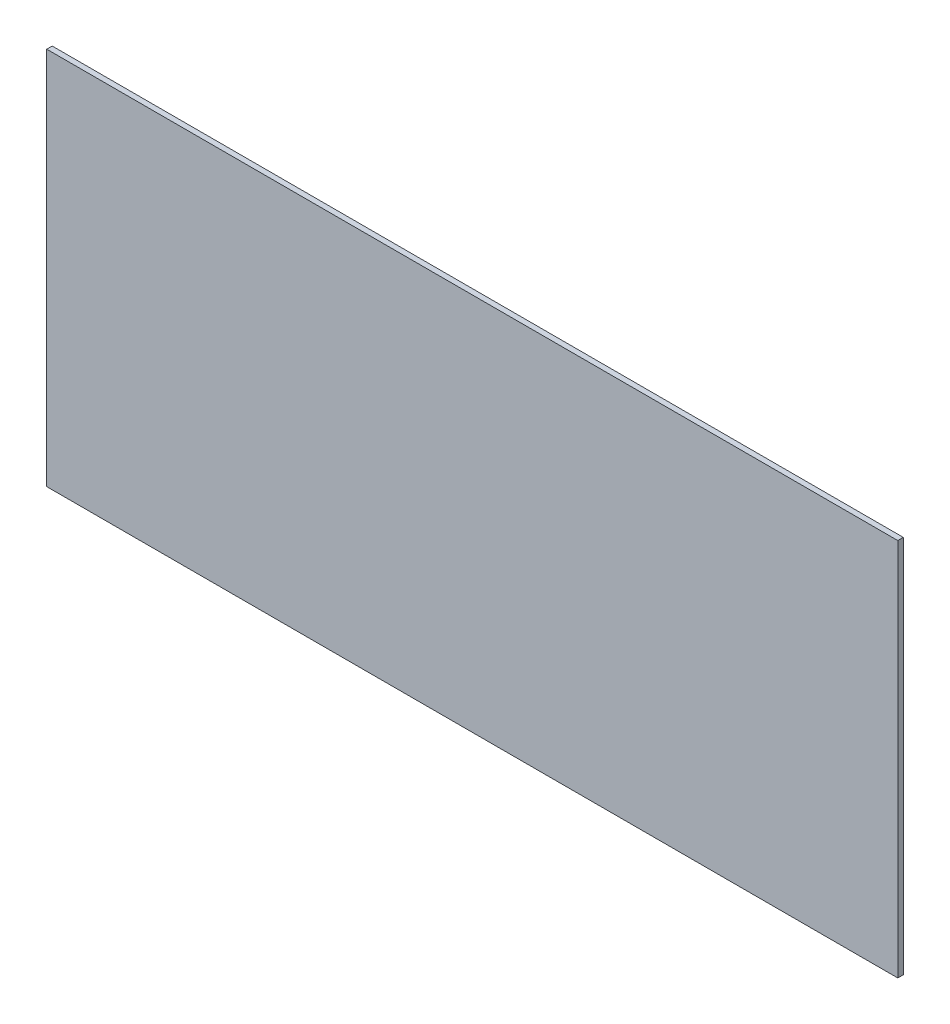
ISO-10303-21;
HEADER;
FILE_DESCRIPTION(('STEP AP214'),'2;1');
FILE_NAME('part.step','',(''),(''),'','','');
FILE_SCHEMA(('AUTOMOTIVE_DESIGN { 1 0 10303 214 1 1 1 1 }'));
ENDSEC;
DATA;
#1=APPLICATION_CONTEXT('core data for automotive mechanical design processes');
#2=APPLICATION_PROTOCOL_DEFINITION('international standard','automotive_design',2000,#1);
#3=PRODUCT_CONTEXT('',#1,'mechanical');
#4=PRODUCT('Part','Part','',(#3));
#5=PRODUCT_RELATED_PRODUCT_CATEGORY('part','',(#4));
#6=PRODUCT_DEFINITION_FORMATION('','',#4);
#7=PRODUCT_DEFINITION_CONTEXT('part definition',#1,'design');
#8=PRODUCT_DEFINITION('design','',#6,#7);
#9=PRODUCT_DEFINITION_SHAPE('','',#8);
#10=(LENGTH_UNIT() NAMED_UNIT(*) SI_UNIT(.MILLI.,.METRE.));
#11=(NAMED_UNIT(*) PLANE_ANGLE_UNIT() SI_UNIT($,.RADIAN.));
#12=(NAMED_UNIT(*) SI_UNIT($,.STERADIAN.) SOLID_ANGLE_UNIT());
#13=UNCERTAINTY_MEASURE_WITH_UNIT(LENGTH_MEASURE(1.E-05),#10,'distance_accuracy_value','');
#14=(GEOMETRIC_REPRESENTATION_CONTEXT(3) GLOBAL_UNCERTAINTY_ASSIGNED_CONTEXT((#13)) GLOBAL_UNIT_ASSIGNED_CONTEXT((#10,
#11,#12)) REPRESENTATION_CONTEXT('',''));
#15=CARTESIAN_POINT('',(0.,0.,0.));
#16=DIRECTION('',(0.,0.,1.));
#17=DIRECTION('',(1.,0.,0.));
#18=AXIS2_PLACEMENT_3D('',#15,#16,#17);
#19=CARTESIAN_POINT('',(0.,0.,6.35));
#20=DIRECTION('',(1.,0.,0.));
#21=DIRECTION('',(0.,1.,0.));
#22=AXIS2_PLACEMENT_3D('',#19,#20,#21);
#23=PLANE('',#22);
#24=DIRECTION('',(0.,-1.,0.));
#25=VECTOR('',#24,1.);
#26=CARTESIAN_POINT('',(0.,0.,0.));
#27=LINE('',#26,#25);
#28=CARTESIAN_POINT('',(-1.11022302462516E-13,438.15,0.));
#29=VERTEX_POINT('',#28);
#30=CARTESIAN_POINT('',(0.,0.,0.));
#31=VERTEX_POINT('',#30);
#32=EDGE_CURVE('E96',#29,#31,#27,.T.);
#33=ORIENTED_EDGE('',*,*,#32,.T.);
#34=DIRECTION('',(0.,0.,-1.));
#35=VECTOR('',#34,1.);
#36=CARTESIAN_POINT('',(0.,0.,6.35));
#37=LINE('',#36,#35);
#38=CARTESIAN_POINT('',(0.,0.,6.35));
#39=VERTEX_POINT('',#38);
#40=EDGE_CURVE('E11',#39,#31,#37,.T.);
#41=ORIENTED_EDGE('',*,*,#40,.F.);
#42=DIRECTION('',(0.,-1.,0.));
#43=VECTOR('',#42,1.);
#44=CARTESIAN_POINT('',(0.,0.,6.35));
#45=LINE('',#44,#43);
#46=CARTESIAN_POINT('',(-1.11022302462516E-13,438.15,6.35));
#47=VERTEX_POINT('',#46);
#48=EDGE_CURVE('E84',#47,#39,#45,.T.);
#49=ORIENTED_EDGE('',*,*,#48,.F.);
#50=DIRECTION('',(0.,0.,-1.));
#51=VECTOR('',#50,1.);
#52=CARTESIAN_POINT('',(-1.11022302462516E-13,438.15,6.35));
#53=LINE('',#52,#51);
#54=EDGE_CURVE('E92',#47,#29,#53,.T.);
#55=ORIENTED_EDGE('',*,*,#54,.T.);
#56=EDGE_LOOP('',(#33,#41,#49,#55));
#57=FACE_BOUND('',#56,.T.);
#58=ADVANCED_FACE('F33',(#57),#23,.F.);
#59=CARTESIAN_POINT('',(0.,0.,6.35));
#60=DIRECTION('',(0.,1.,0.));
#61=DIRECTION('',(0.,0.,1.));
#62=AXIS2_PLACEMENT_3D('',#59,#60,#61);
#63=PLANE('',#62);
#64=DIRECTION('',(1.,0.,0.));
#65=VECTOR('',#64,1.);
#66=CARTESIAN_POINT('',(0.,0.,0.));
#67=LINE('',#66,#65);
#68=CARTESIAN_POINT('',(984.25,0.,0.));
#69=VERTEX_POINT('',#68);
#70=EDGE_CURVE('E88',#31,#69,#67,.T.);
#71=ORIENTED_EDGE('',*,*,#70,.T.);
#72=DIRECTION('',(0.,0.,-1.));
#73=VECTOR('',#72,1.);
#74=CARTESIAN_POINT('',(984.25,0.,6.35));
#75=LINE('',#74,#73);
#76=CARTESIAN_POINT('',(984.25,0.,6.35));
#77=VERTEX_POINT('',#76);
#78=EDGE_CURVE('E41',#77,#69,#75,.T.);
#79=ORIENTED_EDGE('',*,*,#78,.F.);
#80=DIRECTION('',(1.,0.,0.));
#81=VECTOR('',#80,1.);
#82=CARTESIAN_POINT('',(0.,0.,6.35));
#83=LINE('',#82,#81);
#84=EDGE_CURVE('E79',#39,#77,#83,.T.);
#85=ORIENTED_EDGE('',*,*,#84,.F.);
#86=ORIENTED_EDGE('',*,*,#40,.T.);
#87=EDGE_LOOP('',(#71,#79,#85,#86));
#88=FACE_BOUND('',#87,.T.);
#89=ADVANCED_FACE('F87',(#88),#63,.F.);
#90=CARTESIAN_POINT('',(984.25,0.,6.35));
#91=DIRECTION('',(-1.,0.,0.));
#92=DIRECTION('',(0.,-1.,0.));
#93=AXIS2_PLACEMENT_3D('',#90,#91,#92);
#94=PLANE('',#93);
#95=DIRECTION('',(0.,1.,0.));
#96=VECTOR('',#95,1.);
#97=CARTESIAN_POINT('',(984.25,0.,0.));
#98=LINE('',#97,#96);
#99=CARTESIAN_POINT('',(984.25,438.15,0.));
#100=VERTEX_POINT('',#99);
#101=EDGE_CURVE('E66',#69,#100,#98,.T.);
#102=ORIENTED_EDGE('',*,*,#101,.T.);
#103=DIRECTION('',(0.,0.,-1.));
#104=VECTOR('',#103,1.);
#105=CARTESIAN_POINT('',(984.25,438.15,6.35));
#106=LINE('',#105,#104);
#107=CARTESIAN_POINT('',(984.25,438.15,6.35));
#108=VERTEX_POINT('',#107);
#109=EDGE_CURVE('E89',#108,#100,#106,.T.);
#110=ORIENTED_EDGE('',*,*,#109,.F.);
#111=DIRECTION('',(0.,1.,0.));
#112=VECTOR('',#111,1.);
#113=CARTESIAN_POINT('',(984.25,0.,6.35));
#114=LINE('',#113,#112);
#115=EDGE_CURVE('E82',#77,#108,#114,.T.);
#116=ORIENTED_EDGE('',*,*,#115,.F.);
#117=ORIENTED_EDGE('',*,*,#78,.T.);
#118=EDGE_LOOP('',(#102,#110,#116,#117));
#119=FACE_BOUND('',#118,.T.);
#120=ADVANCED_FACE('F90',(#119),#94,.F.);
#121=CARTESIAN_POINT('',(-1.11022302462516E-13,438.15,6.35));
#122=DIRECTION('',(0.,-1.,0.));
#123=DIRECTION('',(0.,0.,-1.));
#124=AXIS2_PLACEMENT_3D('',#121,#122,#123);
#125=PLANE('',#124);
#126=DIRECTION('',(-1.,0.,0.));
#127=VECTOR('',#126,1.);
#128=CARTESIAN_POINT('',(-1.11022302462516E-13,438.15,0.));
#129=LINE('',#128,#127);
#130=EDGE_CURVE('E72',#100,#29,#129,.T.);
#131=ORIENTED_EDGE('',*,*,#130,.T.);
#132=ORIENTED_EDGE('',*,*,#54,.F.);
#133=DIRECTION('',(-1.,0.,0.));
#134=VECTOR('',#133,1.);
#135=CARTESIAN_POINT('',(-1.11022302462516E-13,438.15,6.35));
#136=LINE('',#135,#134);
#137=EDGE_CURVE('E49',#108,#47,#136,.T.);
#138=ORIENTED_EDGE('',*,*,#137,.F.);
#139=ORIENTED_EDGE('',*,*,#109,.T.);
#140=EDGE_LOOP('',(#131,#132,#138,#139));
#141=FACE_BOUND('',#140,.T.);
#142=ADVANCED_FACE('F103',(#141),#125,.F.);
#143=CARTESIAN_POINT('',(0.,0.,6.35));
#144=DIRECTION('',(0.,0.,-1.));
#145=DIRECTION('',(-1.,0.,0.));
#146=AXIS2_PLACEMENT_3D('',#143,#144,#145);
#147=PLANE('',#146);
#148=ORIENTED_EDGE('',*,*,#48,.T.);
#149=ORIENTED_EDGE('',*,*,#84,.T.);
#150=ORIENTED_EDGE('',*,*,#115,.T.);
#151=ORIENTED_EDGE('',*,*,#137,.T.);
#152=EDGE_LOOP('',(#148,#149,#150,#151));
#153=FACE_BOUND('',#152,.T.);
#154=ADVANCED_FACE('F80',(#153),#147,.F.);
#155=CARTESIAN_POINT('',(0.,0.,0.));
#156=DIRECTION('',(0.,0.,-1.));
#157=DIRECTION('',(-1.,0.,0.));
#158=AXIS2_PLACEMENT_3D('',#155,#156,#157);
#159=PLANE('',#158);
#160=ORIENTED_EDGE('',*,*,#32,.F.);
#161=ORIENTED_EDGE('',*,*,#130,.F.);
#162=ORIENTED_EDGE('',*,*,#101,.F.);
#163=ORIENTED_EDGE('',*,*,#70,.F.);
#164=EDGE_LOOP('',(#160,#161,#162,#163));
#165=FACE_BOUND('',#164,.T.);
#166=ADVANCED_FACE('F106',(#165),#159,.T.);
#167=CLOSED_SHELL('',(#58,#89,#120,#142,#154,#166));
#168=MANIFOLD_SOLID_BREP('B2',#167);
#169=ADVANCED_BREP_SHAPE_REPRESENTATION('',(#18,#168),#14);
#170=SHAPE_DEFINITION_REPRESENTATION(#9,#169);
ENDSEC;
END-ISO-10303-21;
